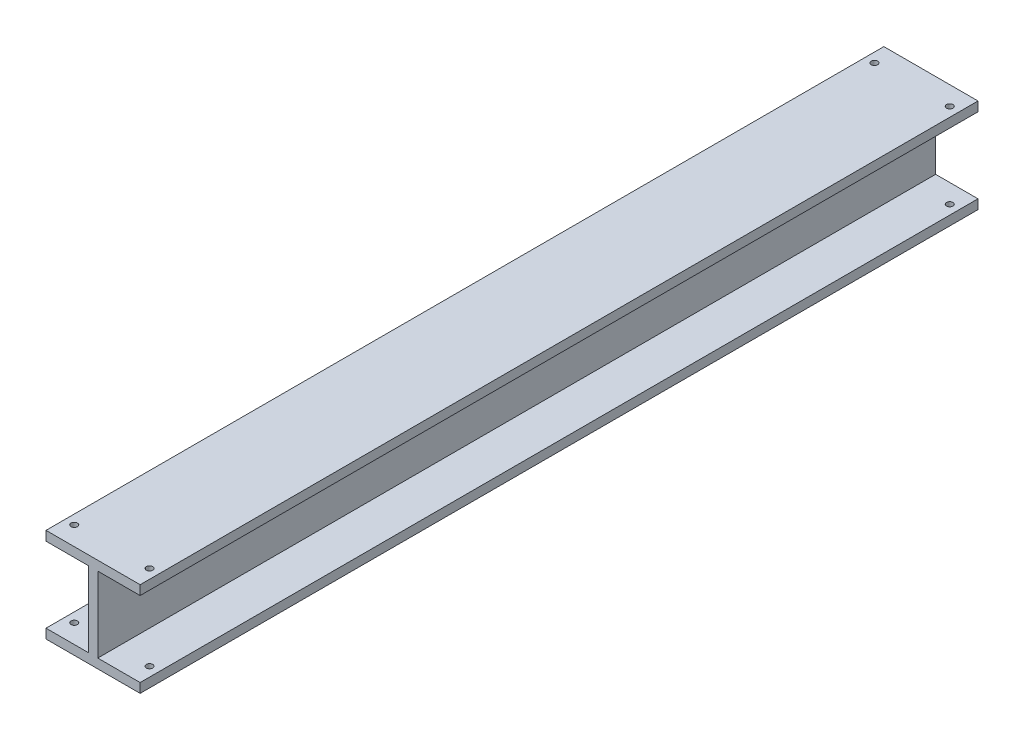
ISO-10303-21;
HEADER;
FILE_DESCRIPTION(('STEP AP214'),'2;1');
FILE_NAME('part.step','',(''),(''),'','','');
FILE_SCHEMA(('AUTOMOTIVE_DESIGN { 1 0 10303 214 1 1 1 1 }'));
ENDSEC;
DATA;
#1=APPLICATION_CONTEXT('core data for automotive mechanical design processes');
#2=APPLICATION_PROTOCOL_DEFINITION('international standard','automotive_design',2000,#1);
#3=PRODUCT_CONTEXT('',#1,'mechanical');
#4=PRODUCT('Part','Part','',(#3));
#5=PRODUCT_RELATED_PRODUCT_CATEGORY('part','',(#4));
#6=PRODUCT_DEFINITION_FORMATION('','',#4);
#7=PRODUCT_DEFINITION_CONTEXT('part definition',#1,'design');
#8=PRODUCT_DEFINITION('design','',#6,#7);
#9=PRODUCT_DEFINITION_SHAPE('','',#8);
#10=(LENGTH_UNIT() NAMED_UNIT(*) SI_UNIT(.MILLI.,.METRE.));
#11=(NAMED_UNIT(*) PLANE_ANGLE_UNIT() SI_UNIT($,.RADIAN.));
#12=(NAMED_UNIT(*) SI_UNIT($,.STERADIAN.) SOLID_ANGLE_UNIT());
#13=UNCERTAINTY_MEASURE_WITH_UNIT(LENGTH_MEASURE(1.E-05),#10,'distance_accuracy_value','');
#14=(GEOMETRIC_REPRESENTATION_CONTEXT(3) GLOBAL_UNCERTAINTY_ASSIGNED_CONTEXT((#13)) GLOBAL_UNIT_ASSIGNED_CONTEXT((#10,
#11,#12)) REPRESENTATION_CONTEXT('',''));
#15=CARTESIAN_POINT('',(0.,0.,0.));
#16=DIRECTION('',(0.,0.,1.));
#17=DIRECTION('',(1.,0.,0.));
#18=AXIS2_PLACEMENT_3D('',#15,#16,#17);
#19=CARTESIAN_POINT('',(-50.,40.,890.));
#20=DIRECTION('',(1.,0.,0.));
#21=DIRECTION('',(0.,0.,-1.));
#22=AXIS2_PLACEMENT_3D('',#19,#20,#21);
#23=PLANE('',#22);
#24=DIRECTION('',(0.,-1.,0.));
#25=VECTOR('',#24,1.);
#26=CARTESIAN_POINT('',(-50.,40.,0.));
#27=LINE('',#26,#25);
#28=CARTESIAN_POINT('',(-50.,50.,0.));
#29=VERTEX_POINT('',#28);
#30=CARTESIAN_POINT('',(-50.,40.,0.));
#31=VERTEX_POINT('',#30);
#32=EDGE_CURVE('E158',#29,#31,#27,.T.);
#33=ORIENTED_EDGE('',*,*,#32,.T.);
#34=DIRECTION('',(0.,0.,-1.));
#35=VECTOR('',#34,1.);
#36=CARTESIAN_POINT('',(-50.,40.,890.));
#37=LINE('',#36,#35);
#38=CARTESIAN_POINT('',(-50.,40.,890.));
#39=VERTEX_POINT('',#38);
#40=EDGE_CURVE('E11',#39,#31,#37,.T.);
#41=ORIENTED_EDGE('',*,*,#40,.F.);
#42=DIRECTION('',(0.,-1.,0.));
#43=VECTOR('',#42,1.);
#44=CARTESIAN_POINT('',(-50.,40.,890.));
#45=LINE('',#44,#43);
#46=CARTESIAN_POINT('',(-50.,50.,890.));
#47=VERTEX_POINT('',#46);
#48=EDGE_CURVE('E181',#47,#39,#45,.T.);
#49=ORIENTED_EDGE('',*,*,#48,.F.);
#50=DIRECTION('',(0.,0.,-1.));
#51=VECTOR('',#50,1.);
#52=CARTESIAN_POINT('',(-50.,50.,890.));
#53=LINE('',#52,#51);
#54=EDGE_CURVE('E154',#47,#29,#53,.T.);
#55=ORIENTED_EDGE('',*,*,#54,.T.);
#56=EDGE_LOOP('',(#33,#41,#49,#55));
#57=FACE_BOUND('',#56,.T.);
#58=ADVANCED_FACE('F38',(#57),#23,.F.);
#59=CARTESIAN_POINT('',(-5.00000000000001,40.,890.));
#60=DIRECTION('',(0.,1.,0.));
#61=DIRECTION('',(-1.,0.,0.));
#62=AXIS2_PLACEMENT_3D('',#59,#60,#61);
#63=PLANE('',#62);
#64=CARTESIAN_POINT('',(-40.,40.,20.));
#65=DIRECTION('',(0.,1.,0.));
#66=DIRECTION('',(-1.,0.,0.));
#67=AXIS2_PLACEMENT_3D('',#64,#65,#66);
#68=CIRCLE('',#67,3.39999999999997);
#69=CARTESIAN_POINT('',(-43.4,40.,20.));
#70=VERTEX_POINT('',#69);
#71=EDGE_CURVE('E334',#70,#70,#68,.F.);
#72=ORIENTED_EDGE('',*,*,#71,.F.);
#73=EDGE_LOOP('',(#72));
#74=FACE_BOUND('',#73,.T.);
#75=CARTESIAN_POINT('',(-40.,40.,870.));
#76=DIRECTION('',(0.,1.,0.));
#77=DIRECTION('',(-1.,0.,0.));
#78=AXIS2_PLACEMENT_3D('',#75,#76,#77);
#79=CIRCLE('',#78,3.39999999999997);
#80=CARTESIAN_POINT('',(-43.4,40.,870.));
#81=VERTEX_POINT('',#80);
#82=EDGE_CURVE('E306',#81,#81,#79,.T.);
#83=ORIENTED_EDGE('',*,*,#82,.T.);
#84=EDGE_LOOP('',(#83));
#85=FACE_BOUND('',#84,.T.);
#86=DIRECTION('',(1.,0.,0.));
#87=VECTOR('',#86,1.);
#88=CARTESIAN_POINT('',(-5.00000000000001,40.,0.));
#89=LINE('',#88,#87);
#90=CARTESIAN_POINT('',(-5.00000000000001,40.,0.));
#91=VERTEX_POINT('',#90);
#92=EDGE_CURVE('E161',#31,#91,#89,.T.);
#93=ORIENTED_EDGE('',*,*,#92,.T.);
#94=DIRECTION('',(0.,0.,-1.));
#95=VECTOR('',#94,1.);
#96=CARTESIAN_POINT('',(-5.00000000000001,40.,890.));
#97=LINE('',#96,#95);
#98=CARTESIAN_POINT('',(-5.00000000000001,40.,890.));
#99=VERTEX_POINT('',#98);
#100=EDGE_CURVE('E46',#99,#91,#97,.T.);
#101=ORIENTED_EDGE('',*,*,#100,.F.);
#102=DIRECTION('',(1.,0.,0.));
#103=VECTOR('',#102,1.);
#104=CARTESIAN_POINT('',(-5.00000000000001,40.,890.));
#105=LINE('',#104,#103);
#106=EDGE_CURVE('E109',#39,#99,#105,.T.);
#107=ORIENTED_EDGE('',*,*,#106,.F.);
#108=ORIENTED_EDGE('',*,*,#40,.T.);
#109=EDGE_LOOP('',(#93,#101,#107,#108));
#110=FACE_BOUND('',#109,.T.);
#111=ADVANCED_FACE('F264',(#74,#85,#110),#63,.F.);
#112=CARTESIAN_POINT('',(-5.00000000000001,-40.,890.));
#113=DIRECTION('',(1.,0.,0.));
#114=DIRECTION('',(0.,0.,-1.));
#115=AXIS2_PLACEMENT_3D('',#112,#113,#114);
#116=PLANE('',#115);
#117=DIRECTION('',(0.,-1.,0.));
#118=VECTOR('',#117,1.);
#119=CARTESIAN_POINT('',(-5.00000000000001,-40.,0.));
#120=LINE('',#119,#118);
#121=CARTESIAN_POINT('',(-5.00000000000001,-40.,0.));
#122=VERTEX_POINT('',#121);
#123=EDGE_CURVE('E164',#91,#122,#120,.T.);
#124=ORIENTED_EDGE('',*,*,#123,.T.);
#125=DIRECTION('',(0.,0.,-1.));
#126=VECTOR('',#125,1.);
#127=CARTESIAN_POINT('',(-5.00000000000001,-40.,890.));
#128=LINE('',#127,#126);
#129=CARTESIAN_POINT('',(-5.00000000000001,-40.,890.));
#130=VERTEX_POINT('',#129);
#131=EDGE_CURVE('E200',#130,#122,#128,.T.);
#132=ORIENTED_EDGE('',*,*,#131,.F.);
#133=DIRECTION('',(0.,-1.,0.));
#134=VECTOR('',#133,1.);
#135=CARTESIAN_POINT('',(-5.00000000000001,-40.,890.));
#136=LINE('',#135,#134);
#137=EDGE_CURVE('E208',#99,#130,#136,.T.);
#138=ORIENTED_EDGE('',*,*,#137,.F.);
#139=ORIENTED_EDGE('',*,*,#100,.T.);
#140=EDGE_LOOP('',(#124,#132,#138,#139));
#141=FACE_BOUND('',#140,.T.);
#142=ADVANCED_FACE('F206',(#141),#116,.F.);
#143=CARTESIAN_POINT('',(-50.,-40.,890.));
#144=DIRECTION('',(0.,-1.,0.));
#145=DIRECTION('',(1.,0.,0.));
#146=AXIS2_PLACEMENT_3D('',#143,#144,#145);
#147=PLANE('',#146);
#148=CARTESIAN_POINT('',(-40.,-40.,20.));
#149=DIRECTION('',(0.,-1.,0.));
#150=DIRECTION('',(1.,0.,0.));
#151=AXIS2_PLACEMENT_3D('',#148,#149,#150);
#152=CIRCLE('',#151,3.39999999999997);
#153=CARTESIAN_POINT('',(-36.6,-40.,20.));
#154=VERTEX_POINT('',#153);
#155=EDGE_CURVE('E337',#154,#154,#152,.F.);
#156=ORIENTED_EDGE('',*,*,#155,.F.);
#157=EDGE_LOOP('',(#156));
#158=FACE_BOUND('',#157,.T.);
#159=CARTESIAN_POINT('',(-40.,-40.,870.));
#160=DIRECTION('',(0.,-1.,0.));
#161=DIRECTION('',(1.,0.,0.));
#162=AXIS2_PLACEMENT_3D('',#159,#160,#161);
#163=CIRCLE('',#162,3.39999999999997);
#164=CARTESIAN_POINT('',(-36.6,-40.,870.));
#165=VERTEX_POINT('',#164);
#166=EDGE_CURVE('E311',#165,#165,#163,.T.);
#167=ORIENTED_EDGE('',*,*,#166,.T.);
#168=EDGE_LOOP('',(#167));
#169=FACE_BOUND('',#168,.T.);
#170=DIRECTION('',(-1.,0.,0.));
#171=VECTOR('',#170,1.);
#172=CARTESIAN_POINT('',(-50.,-40.,0.));
#173=LINE('',#172,#171);
#174=CARTESIAN_POINT('',(-50.,-40.,0.));
#175=VERTEX_POINT('',#174);
#176=EDGE_CURVE('E166',#122,#175,#173,.T.);
#177=ORIENTED_EDGE('',*,*,#176,.T.);
#178=DIRECTION('',(0.,0.,-1.));
#179=VECTOR('',#178,1.);
#180=CARTESIAN_POINT('',(-50.,-40.,890.));
#181=LINE('',#180,#179);
#182=CARTESIAN_POINT('',(-50.,-40.,890.));
#183=VERTEX_POINT('',#182);
#184=EDGE_CURVE('E197',#183,#175,#181,.T.);
#185=ORIENTED_EDGE('',*,*,#184,.F.);
#186=DIRECTION('',(-1.,0.,0.));
#187=VECTOR('',#186,1.);
#188=CARTESIAN_POINT('',(-50.,-40.,890.));
#189=LINE('',#188,#187);
#190=EDGE_CURVE('E226',#130,#183,#189,.T.);
#191=ORIENTED_EDGE('',*,*,#190,.F.);
#192=ORIENTED_EDGE('',*,*,#131,.T.);
#193=EDGE_LOOP('',(#177,#185,#191,#192));
#194=FACE_BOUND('',#193,.T.);
#195=ADVANCED_FACE('F217',(#158,#169,#194),#147,.F.);
#196=CARTESIAN_POINT('',(-50.,-50.,890.));
#197=DIRECTION('',(1.,0.,0.));
#198=DIRECTION('',(0.,0.,-1.));
#199=AXIS2_PLACEMENT_3D('',#196,#197,#198);
#200=PLANE('',#199);
#201=DIRECTION('',(0.,-1.,0.));
#202=VECTOR('',#201,1.);
#203=CARTESIAN_POINT('',(-50.,-50.,0.));
#204=LINE('',#203,#202);
#205=CARTESIAN_POINT('',(-50.,-50.,0.));
#206=VERTEX_POINT('',#205);
#207=EDGE_CURVE('E168',#175,#206,#204,.T.);
#208=ORIENTED_EDGE('',*,*,#207,.T.);
#209=DIRECTION('',(0.,0.,-1.));
#210=VECTOR('',#209,1.);
#211=CARTESIAN_POINT('',(-50.,-50.,890.));
#212=LINE('',#211,#210);
#213=CARTESIAN_POINT('',(-50.,-50.,890.));
#214=VERTEX_POINT('',#213);
#215=EDGE_CURVE('E194',#214,#206,#212,.T.);
#216=ORIENTED_EDGE('',*,*,#215,.F.);
#217=DIRECTION('',(0.,-1.,0.));
#218=VECTOR('',#217,1.);
#219=CARTESIAN_POINT('',(-50.,-50.,890.));
#220=LINE('',#219,#218);
#221=EDGE_CURVE('E223',#183,#214,#220,.T.);
#222=ORIENTED_EDGE('',*,*,#221,.F.);
#223=ORIENTED_EDGE('',*,*,#184,.T.);
#224=EDGE_LOOP('',(#208,#216,#222,#223));
#225=FACE_BOUND('',#224,.T.);
#226=ADVANCED_FACE('F221',(#225),#200,.F.);
#227=CARTESIAN_POINT('',(50.,-50.,890.));
#228=DIRECTION('',(0.,1.,0.));
#229=DIRECTION('',(0.,0.,1.));
#230=AXIS2_PLACEMENT_3D('',#227,#228,#229);
#231=PLANE('',#230);
#232=CARTESIAN_POINT('',(40.,-50.,20.));
#233=DIRECTION('',(0.,-1.,0.));
#234=DIRECTION('',(0.,0.,-1.));
#235=AXIS2_PLACEMENT_3D('',#232,#233,#234);
#236=CIRCLE('',#235,3.39999999999997);
#237=CARTESIAN_POINT('',(40.,-50.,16.6));
#238=VERTEX_POINT('',#237);
#239=EDGE_CURVE('E340',#238,#238,#236,.T.);
#240=ORIENTED_EDGE('',*,*,#239,.F.);
#241=EDGE_LOOP('',(#240));
#242=FACE_BOUND('',#241,.T.);
#243=CARTESIAN_POINT('',(-40.,-50.,20.));
#244=DIRECTION('',(0.,-1.,0.));
#245=DIRECTION('',(0.,0.,1.));
#246=AXIS2_PLACEMENT_3D('',#243,#244,#245);
#247=CIRCLE('',#246,3.39999999999997);
#248=CARTESIAN_POINT('',(-40.,-50.,23.4));
#249=VERTEX_POINT('',#248);
#250=EDGE_CURVE('E344',#249,#249,#247,.T.);
#251=ORIENTED_EDGE('',*,*,#250,.F.);
#252=EDGE_LOOP('',(#251));
#253=FACE_BOUND('',#252,.T.);
#254=CARTESIAN_POINT('',(40.,-50.,870.));
#255=DIRECTION('',(0.,1.,0.));
#256=DIRECTION('',(0.,0.,1.));
#257=AXIS2_PLACEMENT_3D('',#254,#255,#256);
#258=CIRCLE('',#257,3.39999999999997);
#259=CARTESIAN_POINT('',(40.,-50.,873.4));
#260=VERTEX_POINT('',#259);
#261=EDGE_CURVE('E318',#260,#260,#258,.T.);
#262=ORIENTED_EDGE('',*,*,#261,.T.);
#263=EDGE_LOOP('',(#262));
#264=FACE_BOUND('',#263,.T.);
#265=CARTESIAN_POINT('',(-40.,-50.,870.));
#266=DIRECTION('',(0.,1.,0.));
#267=DIRECTION('',(0.,0.,-1.));
#268=AXIS2_PLACEMENT_3D('',#265,#266,#267);
#269=CIRCLE('',#268,3.39999999999997);
#270=CARTESIAN_POINT('',(-40.,-50.,866.6));
#271=VERTEX_POINT('',#270);
#272=EDGE_CURVE('E322',#271,#271,#269,.T.);
#273=ORIENTED_EDGE('',*,*,#272,.T.);
#274=EDGE_LOOP('',(#273));
#275=FACE_BOUND('',#274,.T.);
#276=DIRECTION('',(1.,0.,0.));
#277=VECTOR('',#276,1.);
#278=CARTESIAN_POINT('',(50.,-50.,0.));
#279=LINE('',#278,#277);
#280=CARTESIAN_POINT('',(50.,-50.,0.));
#281=VERTEX_POINT('',#280);
#282=EDGE_CURVE('E170',#206,#281,#279,.T.);
#283=ORIENTED_EDGE('',*,*,#282,.T.);
#284=DIRECTION('',(0.,0.,-1.));
#285=VECTOR('',#284,1.);
#286=CARTESIAN_POINT('',(50.,-50.,890.));
#287=LINE('',#286,#285);
#288=CARTESIAN_POINT('',(50.,-50.,890.));
#289=VERTEX_POINT('',#288);
#290=EDGE_CURVE('E191',#289,#281,#287,.T.);
#291=ORIENTED_EDGE('',*,*,#290,.F.);
#292=DIRECTION('',(1.,0.,0.));
#293=VECTOR('',#292,1.);
#294=CARTESIAN_POINT('',(50.,-50.,890.));
#295=LINE('',#294,#293);
#296=EDGE_CURVE('E225',#214,#289,#295,.T.);
#297=ORIENTED_EDGE('',*,*,#296,.F.);
#298=ORIENTED_EDGE('',*,*,#215,.T.);
#299=EDGE_LOOP('',(#283,#291,#297,#298));
#300=FACE_BOUND('',#299,.T.);
#301=ADVANCED_FACE('F282',(#242,#253,#264,#275,#300),#231,.F.);
#302=CARTESIAN_POINT('',(50.,-40.,890.));
#303=DIRECTION('',(-1.,0.,0.));
#304=DIRECTION('',(0.,0.,1.));
#305=AXIS2_PLACEMENT_3D('',#302,#303,#304);
#306=PLANE('',#305);
#307=DIRECTION('',(0.,1.,0.));
#308=VECTOR('',#307,1.);
#309=CARTESIAN_POINT('',(50.,-40.,0.));
#310=LINE('',#309,#308);
#311=CARTESIAN_POINT('',(50.,-40.,0.));
#312=VERTEX_POINT('',#311);
#313=EDGE_CURVE('E172',#281,#312,#310,.T.);
#314=ORIENTED_EDGE('',*,*,#313,.T.);
#315=DIRECTION('',(0.,0.,-1.));
#316=VECTOR('',#315,1.);
#317=CARTESIAN_POINT('',(50.,-40.,890.));
#318=LINE('',#317,#316);
#319=CARTESIAN_POINT('',(50.,-40.,890.));
#320=VERTEX_POINT('',#319);
#321=EDGE_CURVE('E188',#320,#312,#318,.T.);
#322=ORIENTED_EDGE('',*,*,#321,.F.);
#323=DIRECTION('',(0.,1.,0.));
#324=VECTOR('',#323,1.);
#325=CARTESIAN_POINT('',(50.,-40.,890.));
#326=LINE('',#325,#324);
#327=EDGE_CURVE('E228',#289,#320,#326,.T.);
#328=ORIENTED_EDGE('',*,*,#327,.F.);
#329=ORIENTED_EDGE('',*,*,#290,.T.);
#330=EDGE_LOOP('',(#314,#322,#328,#329));
#331=FACE_BOUND('',#330,.T.);
#332=ADVANCED_FACE('F285',(#331),#306,.F.);
#333=CARTESIAN_POINT('',(5.00000000000001,-40.,890.));
#334=DIRECTION('',(0.,-1.,0.));
#335=DIRECTION('',(1.,0.,0.));
#336=AXIS2_PLACEMENT_3D('',#333,#334,#335);
#337=PLANE('',#336);
#338=CARTESIAN_POINT('',(40.,-40.,20.));
#339=DIRECTION('',(0.,-1.,0.));
#340=DIRECTION('',(1.,0.,0.));
#341=AXIS2_PLACEMENT_3D('',#338,#339,#340);
#342=CIRCLE('',#341,3.39999999999997);
#343=CARTESIAN_POINT('',(43.4,-40.,20.));
#344=VERTEX_POINT('',#343);
#345=EDGE_CURVE('E323',#344,#344,#342,.F.);
#346=ORIENTED_EDGE('',*,*,#345,.F.);
#347=EDGE_LOOP('',(#346));
#348=FACE_BOUND('',#347,.T.);
#349=CARTESIAN_POINT('',(40.,-40.,870.));
#350=DIRECTION('',(0.,-1.,0.));
#351=DIRECTION('',(1.,0.,0.));
#352=AXIS2_PLACEMENT_3D('',#349,#350,#351);
#353=CIRCLE('',#352,3.39999999999997);
#354=CARTESIAN_POINT('',(43.4,-40.,870.));
#355=VERTEX_POINT('',#354);
#356=EDGE_CURVE('E162',#355,#355,#353,.T.);
#357=ORIENTED_EDGE('',*,*,#356,.T.);
#358=EDGE_LOOP('',(#357));
#359=FACE_BOUND('',#358,.T.);
#360=DIRECTION('',(-1.,0.,0.));
#361=VECTOR('',#360,1.);
#362=CARTESIAN_POINT('',(5.00000000000001,-40.,0.));
#363=LINE('',#362,#361);
#364=CARTESIAN_POINT('',(5.00000000000001,-40.,0.));
#365=VERTEX_POINT('',#364);
#366=EDGE_CURVE('E174',#312,#365,#363,.T.);
#367=ORIENTED_EDGE('',*,*,#366,.T.);
#368=DIRECTION('',(0.,0.,-1.));
#369=VECTOR('',#368,1.);
#370=CARTESIAN_POINT('',(5.00000000000001,-40.,890.));
#371=LINE('',#370,#369);
#372=CARTESIAN_POINT('',(5.00000000000001,-40.,890.));
#373=VERTEX_POINT('',#372);
#374=EDGE_CURVE('E185',#373,#365,#371,.T.);
#375=ORIENTED_EDGE('',*,*,#374,.F.);
#376=DIRECTION('',(-1.,0.,0.));
#377=VECTOR('',#376,1.);
#378=CARTESIAN_POINT('',(5.00000000000001,-40.,890.));
#379=LINE('',#378,#377);
#380=EDGE_CURVE('E234',#320,#373,#379,.T.);
#381=ORIENTED_EDGE('',*,*,#380,.F.);
#382=ORIENTED_EDGE('',*,*,#321,.T.);
#383=EDGE_LOOP('',(#367,#375,#381,#382));
#384=FACE_BOUND('',#383,.T.);
#385=ADVANCED_FACE('F240',(#348,#359,#384),#337,.F.);
#386=CARTESIAN_POINT('',(5.00000000000001,40.,890.));
#387=DIRECTION('',(-1.,0.,0.));
#388=DIRECTION('',(0.,0.,1.));
#389=AXIS2_PLACEMENT_3D('',#386,#387,#388);
#390=PLANE('',#389);
#391=DIRECTION('',(0.,1.,0.));
#392=VECTOR('',#391,1.);
#393=CARTESIAN_POINT('',(5.00000000000001,40.,0.));
#394=LINE('',#393,#392);
#395=CARTESIAN_POINT('',(5.00000000000001,40.,0.));
#396=VERTEX_POINT('',#395);
#397=EDGE_CURVE('E176',#365,#396,#394,.T.);
#398=ORIENTED_EDGE('',*,*,#397,.T.);
#399=DIRECTION('',(0.,0.,-1.));
#400=VECTOR('',#399,1.);
#401=CARTESIAN_POINT('',(5.00000000000001,40.,890.));
#402=LINE('',#401,#400);
#403=CARTESIAN_POINT('',(5.00000000000001,40.,890.));
#404=VERTEX_POINT('',#403);
#405=EDGE_CURVE('E149',#404,#396,#402,.T.);
#406=ORIENTED_EDGE('',*,*,#405,.F.);
#407=DIRECTION('',(0.,1.,0.));
#408=VECTOR('',#407,1.);
#409=CARTESIAN_POINT('',(5.00000000000001,40.,890.));
#410=LINE('',#409,#408);
#411=EDGE_CURVE('E140',#373,#404,#410,.T.);
#412=ORIENTED_EDGE('',*,*,#411,.F.);
#413=ORIENTED_EDGE('',*,*,#374,.T.);
#414=EDGE_LOOP('',(#398,#406,#412,#413));
#415=FACE_BOUND('',#414,.T.);
#416=ADVANCED_FACE('F244',(#415),#390,.F.);
#417=CARTESIAN_POINT('',(50.,40.,890.));
#418=DIRECTION('',(0.,1.,0.));
#419=DIRECTION('',(-1.,0.,0.));
#420=AXIS2_PLACEMENT_3D('',#417,#418,#419);
#421=PLANE('',#420);
#422=CARTESIAN_POINT('',(40.,40.,20.));
#423=DIRECTION('',(0.,1.,0.));
#424=DIRECTION('',(-1.,0.,0.));
#425=AXIS2_PLACEMENT_3D('',#422,#423,#424);
#426=CIRCLE('',#425,3.39999999999997);
#427=CARTESIAN_POINT('',(36.6,40.,20.));
#428=VERTEX_POINT('',#427);
#429=EDGE_CURVE('E301',#428,#428,#426,.F.);
#430=ORIENTED_EDGE('',*,*,#429,.F.);
#431=EDGE_LOOP('',(#430));
#432=FACE_BOUND('',#431,.T.);
#433=CARTESIAN_POINT('',(40.,40.,870.));
#434=DIRECTION('',(0.,1.,0.));
#435=DIRECTION('',(-1.,0.,0.));
#436=AXIS2_PLACEMENT_3D('',#433,#434,#435);
#437=CIRCLE('',#436,3.39999999999997);
#438=CARTESIAN_POINT('',(36.6,40.,870.));
#439=VERTEX_POINT('',#438);
#440=EDGE_CURVE('E304',#439,#439,#437,.T.);
#441=ORIENTED_EDGE('',*,*,#440,.T.);
#442=EDGE_LOOP('',(#441));
#443=FACE_BOUND('',#442,.T.);
#444=DIRECTION('',(1.,0.,0.));
#445=VECTOR('',#444,1.);
#446=CARTESIAN_POINT('',(50.,40.,0.));
#447=LINE('',#446,#445);
#448=CARTESIAN_POINT('',(50.,40.,0.));
#449=VERTEX_POINT('',#448);
#450=EDGE_CURVE('E148',#396,#449,#447,.T.);
#451=ORIENTED_EDGE('',*,*,#450,.T.);
#452=DIRECTION('',(0.,0.,-1.));
#453=VECTOR('',#452,1.);
#454=CARTESIAN_POINT('',(50.,40.,890.));
#455=LINE('',#454,#453);
#456=CARTESIAN_POINT('',(50.,40.,890.));
#457=VERTEX_POINT('',#456);
#458=EDGE_CURVE('E145',#457,#449,#455,.T.);
#459=ORIENTED_EDGE('',*,*,#458,.F.);
#460=DIRECTION('',(1.,0.,0.));
#461=VECTOR('',#460,1.);
#462=CARTESIAN_POINT('',(50.,40.,890.));
#463=LINE('',#462,#461);
#464=EDGE_CURVE('E134',#404,#457,#463,.T.);
#465=ORIENTED_EDGE('',*,*,#464,.F.);
#466=ORIENTED_EDGE('',*,*,#405,.T.);
#467=EDGE_LOOP('',(#451,#459,#465,#466));
#468=FACE_BOUND('',#467,.T.);
#469=ADVANCED_FACE('F146',(#432,#443,#468),#421,.F.);
#470=CARTESIAN_POINT('',(50.,50.,890.));
#471=DIRECTION('',(-1.,0.,0.));
#472=DIRECTION('',(0.,0.,1.));
#473=AXIS2_PLACEMENT_3D('',#470,#471,#472);
#474=PLANE('',#473);
#475=DIRECTION('',(0.,1.,0.));
#476=VECTOR('',#475,1.);
#477=CARTESIAN_POINT('',(50.,50.,0.));
#478=LINE('',#477,#476);
#479=CARTESIAN_POINT('',(50.,50.,0.));
#480=VERTEX_POINT('',#479);
#481=EDGE_CURVE('E95',#449,#480,#478,.T.);
#482=ORIENTED_EDGE('',*,*,#481,.T.);
#483=DIRECTION('',(0.,0.,-1.));
#484=VECTOR('',#483,1.);
#485=CARTESIAN_POINT('',(50.,50.,890.));
#486=LINE('',#485,#484);
#487=CARTESIAN_POINT('',(50.,50.,890.));
#488=VERTEX_POINT('',#487);
#489=EDGE_CURVE('E150',#488,#480,#486,.T.);
#490=ORIENTED_EDGE('',*,*,#489,.F.);
#491=DIRECTION('',(0.,1.,0.));
#492=VECTOR('',#491,1.);
#493=CARTESIAN_POINT('',(50.,50.,890.));
#494=LINE('',#493,#492);
#495=EDGE_CURVE('E138',#457,#488,#494,.T.);
#496=ORIENTED_EDGE('',*,*,#495,.F.);
#497=ORIENTED_EDGE('',*,*,#458,.T.);
#498=EDGE_LOOP('',(#482,#490,#496,#497));
#499=FACE_BOUND('',#498,.T.);
#500=ADVANCED_FACE('F152',(#499),#474,.F.);
#501=CARTESIAN_POINT('',(-50.,50.,890.));
#502=DIRECTION('',(0.,-1.,0.));
#503=DIRECTION('',(0.,0.,-1.));
#504=AXIS2_PLACEMENT_3D('',#501,#502,#503);
#505=PLANE('',#504);
#506=CARTESIAN_POINT('',(40.,50.,20.));
#507=DIRECTION('',(0.,-1.,0.));
#508=DIRECTION('',(0.,0.,-1.));
#509=AXIS2_PLACEMENT_3D('',#506,#507,#508);
#510=CIRCLE('',#509,3.39999999999997);
#511=CARTESIAN_POINT('',(40.,50.,16.6));
#512=VERTEX_POINT('',#511);
#513=EDGE_CURVE('E347',#512,#512,#510,.T.);
#514=ORIENTED_EDGE('',*,*,#513,.T.);
#515=EDGE_LOOP('',(#514));
#516=FACE_BOUND('',#515,.T.);
#517=CARTESIAN_POINT('',(-40.,50.,20.));
#518=DIRECTION('',(0.,-1.,0.));
#519=DIRECTION('',(0.,0.,1.));
#520=AXIS2_PLACEMENT_3D('',#517,#518,#519);
#521=CIRCLE('',#520,3.39999999999997);
#522=CARTESIAN_POINT('',(-40.,50.,23.4));
#523=VERTEX_POINT('',#522);
#524=EDGE_CURVE('E341',#523,#523,#521,.T.);
#525=ORIENTED_EDGE('',*,*,#524,.T.);
#526=EDGE_LOOP('',(#525));
#527=FACE_BOUND('',#526,.T.);
#528=CARTESIAN_POINT('',(40.,50.,870.));
#529=DIRECTION('',(0.,1.,0.));
#530=DIRECTION('',(0.,0.,1.));
#531=AXIS2_PLACEMENT_3D('',#528,#529,#530);
#532=CIRCLE('',#531,3.39999999999997);
#533=CARTESIAN_POINT('',(40.,50.,873.4));
#534=VERTEX_POINT('',#533);
#535=EDGE_CURVE('E326',#534,#534,#532,.T.);
#536=ORIENTED_EDGE('',*,*,#535,.F.);
#537=EDGE_LOOP('',(#536));
#538=FACE_BOUND('',#537,.T.);
#539=CARTESIAN_POINT('',(-40.,50.,870.));
#540=DIRECTION('',(0.,1.,0.));
#541=DIRECTION('',(0.,0.,-1.));
#542=AXIS2_PLACEMENT_3D('',#539,#540,#541);
#543=CIRCLE('',#542,3.39999999999997);
#544=CARTESIAN_POINT('',(-40.,50.,866.6));
#545=VERTEX_POINT('',#544);
#546=EDGE_CURVE('E319',#545,#545,#543,.T.);
#547=ORIENTED_EDGE('',*,*,#546,.F.);
#548=EDGE_LOOP('',(#547));
#549=FACE_BOUND('',#548,.T.);
#550=DIRECTION('',(-1.,0.,0.));
#551=VECTOR('',#550,1.);
#552=CARTESIAN_POINT('',(-50.,50.,0.));
#553=LINE('',#552,#551);
#554=EDGE_CURVE('E101',#480,#29,#553,.T.);
#555=ORIENTED_EDGE('',*,*,#554,.T.);
#556=ORIENTED_EDGE('',*,*,#54,.F.);
#557=DIRECTION('',(-1.,0.,0.));
#558=VECTOR('',#557,1.);
#559=CARTESIAN_POINT('',(-50.,50.,890.));
#560=LINE('',#559,#558);
#561=EDGE_CURVE('E54',#488,#47,#560,.T.);
#562=ORIENTED_EDGE('',*,*,#561,.F.);
#563=ORIENTED_EDGE('',*,*,#489,.T.);
#564=EDGE_LOOP('',(#555,#556,#562,#563));
#565=FACE_BOUND('',#564,.T.);
#566=ADVANCED_FACE('F248',(#516,#527,#538,#549,#565),#505,.F.);
#567=CARTESIAN_POINT('',(0.,0.,890.));
#568=DIRECTION('',(0.,0.,-1.));
#569=DIRECTION('',(-1.,0.,0.));
#570=AXIS2_PLACEMENT_3D('',#567,#568,#569);
#571=PLANE('',#570);
#572=ORIENTED_EDGE('',*,*,#48,.T.);
#573=ORIENTED_EDGE('',*,*,#106,.T.);
#574=ORIENTED_EDGE('',*,*,#137,.T.);
#575=ORIENTED_EDGE('',*,*,#190,.T.);
#576=ORIENTED_EDGE('',*,*,#221,.T.);
#577=ORIENTED_EDGE('',*,*,#296,.T.);
#578=ORIENTED_EDGE('',*,*,#327,.T.);
#579=ORIENTED_EDGE('',*,*,#380,.T.);
#580=ORIENTED_EDGE('',*,*,#411,.T.);
#581=ORIENTED_EDGE('',*,*,#464,.T.);
#582=ORIENTED_EDGE('',*,*,#495,.T.);
#583=ORIENTED_EDGE('',*,*,#561,.T.);
#584=EDGE_LOOP('',(#572,#573,#574,#575,#576,#577,#578,#579,#580,#581,#582,#583));
#585=FACE_BOUND('',#584,.T.);
#586=ADVANCED_FACE('F136',(#585),#571,.F.);
#587=CARTESIAN_POINT('',(0.,0.,0.));
#588=DIRECTION('',(0.,0.,-1.));
#589=DIRECTION('',(-1.,0.,0.));
#590=AXIS2_PLACEMENT_3D('',#587,#588,#589);
#591=PLANE('',#590);
#592=ORIENTED_EDGE('',*,*,#32,.F.);
#593=ORIENTED_EDGE('',*,*,#554,.F.);
#594=ORIENTED_EDGE('',*,*,#481,.F.);
#595=ORIENTED_EDGE('',*,*,#450,.F.);
#596=ORIENTED_EDGE('',*,*,#397,.F.);
#597=ORIENTED_EDGE('',*,*,#366,.F.);
#598=ORIENTED_EDGE('',*,*,#313,.F.);
#599=ORIENTED_EDGE('',*,*,#282,.F.);
#600=ORIENTED_EDGE('',*,*,#207,.F.);
#601=ORIENTED_EDGE('',*,*,#176,.F.);
#602=ORIENTED_EDGE('',*,*,#123,.F.);
#603=ORIENTED_EDGE('',*,*,#92,.F.);
#604=EDGE_LOOP('',(#592,#593,#594,#595,#596,#597,#598,#599,#600,#601,#602,#603));
#605=FACE_BOUND('',#604,.T.);
#606=ADVANCED_FACE('F212',(#605),#591,.T.);
#607=CARTESIAN_POINT('',(-40.,-50.,870.));
#608=DIRECTION('',(0.,1.,0.));
#609=DIRECTION('',(0.,0.,1.));
#610=AXIS2_PLACEMENT_3D('',#607,#608,#609);
#611=CYLINDRICAL_SURFACE('',#610,3.39999999999997);
#612=ORIENTED_EDGE('',*,*,#546,.T.);
#613=EDGE_LOOP('',(#612));
#614=FACE_BOUND('',#613,.T.);
#615=ORIENTED_EDGE('',*,*,#82,.F.);
#616=EDGE_LOOP('',(#615));
#617=FACE_BOUND('',#616,.T.);
#618=ADVANCED_FACE('F370',(#614,#617),#611,.F.);
#619=CARTESIAN_POINT('',(40.,-50.,870.));
#620=DIRECTION('',(0.,1.,0.));
#621=DIRECTION('',(0.,0.,1.));
#622=AXIS2_PLACEMENT_3D('',#619,#620,#621);
#623=CYLINDRICAL_SURFACE('',#622,3.39999999999997);
#624=ORIENTED_EDGE('',*,*,#535,.T.);
#625=EDGE_LOOP('',(#624));
#626=FACE_BOUND('',#625,.T.);
#627=ORIENTED_EDGE('',*,*,#440,.F.);
#628=EDGE_LOOP('',(#627));
#629=FACE_BOUND('',#628,.T.);
#630=ADVANCED_FACE('F380',(#626,#629),#623,.F.);
#631=ORIENTED_EDGE('',*,*,#261,.F.);
#632=EDGE_LOOP('',(#631));
#633=FACE_BOUND('',#632,.T.);
#634=ORIENTED_EDGE('',*,*,#356,.F.);
#635=EDGE_LOOP('',(#634));
#636=FACE_BOUND('',#635,.T.);
#637=ADVANCED_FACE('F368',(#633,#636),#623,.F.);
#638=ORIENTED_EDGE('',*,*,#272,.F.);
#639=EDGE_LOOP('',(#638));
#640=FACE_BOUND('',#639,.T.);
#641=ORIENTED_EDGE('',*,*,#166,.F.);
#642=EDGE_LOOP('',(#641));
#643=FACE_BOUND('',#642,.T.);
#644=ADVANCED_FACE('F364',(#640,#643),#611,.F.);
#645=CARTESIAN_POINT('',(-40.,-50.,20.));
#646=DIRECTION('',(0.,1.,0.));
#647=DIRECTION('',(0.,0.,1.));
#648=AXIS2_PLACEMENT_3D('',#645,#646,#647);
#649=CYLINDRICAL_SURFACE('',#648,3.39999999999997);
#650=ORIENTED_EDGE('',*,*,#524,.F.);
#651=EDGE_LOOP('',(#650));
#652=FACE_BOUND('',#651,.T.);
#653=ORIENTED_EDGE('',*,*,#71,.T.);
#654=EDGE_LOOP('',(#653));
#655=FACE_BOUND('',#654,.T.);
#656=ADVANCED_FACE('F367',(#652,#655),#649,.F.);
#657=CARTESIAN_POINT('',(40.,-50.,20.));
#658=DIRECTION('',(0.,1.,0.));
#659=DIRECTION('',(0.,0.,1.));
#660=AXIS2_PLACEMENT_3D('',#657,#658,#659);
#661=CYLINDRICAL_SURFACE('',#660,3.39999999999997);
#662=ORIENTED_EDGE('',*,*,#513,.F.);
#663=EDGE_LOOP('',(#662));
#664=FACE_BOUND('',#663,.T.);
#665=ORIENTED_EDGE('',*,*,#429,.T.);
#666=EDGE_LOOP('',(#665));
#667=FACE_BOUND('',#666,.T.);
#668=ADVANCED_FACE('F376',(#664,#667),#661,.F.);
#669=ORIENTED_EDGE('',*,*,#239,.T.);
#670=EDGE_LOOP('',(#669));
#671=FACE_BOUND('',#670,.T.);
#672=ORIENTED_EDGE('',*,*,#345,.T.);
#673=EDGE_LOOP('',(#672));
#674=FACE_BOUND('',#673,.T.);
#675=ADVANCED_FACE('F352',(#671,#674),#661,.F.);
#676=ORIENTED_EDGE('',*,*,#250,.T.);
#677=EDGE_LOOP('',(#676));
#678=FACE_BOUND('',#677,.T.);
#679=ORIENTED_EDGE('',*,*,#155,.T.);
#680=EDGE_LOOP('',(#679));
#681=FACE_BOUND('',#680,.T.);
#682=ADVANCED_FACE('F379',(#678,#681),#649,.F.);
#683=CLOSED_SHELL('',(#58,#111,#142,#195,#226,#301,#332,#385,#416,#469,#500,#566,#586,#606,#618,
#630,#637,#644,#656,#668,#675,#682));
#684=MANIFOLD_SOLID_BREP('B2',#683);
#685=ADVANCED_BREP_SHAPE_REPRESENTATION('',(#18,#684),#14);
#686=SHAPE_DEFINITION_REPRESENTATION(#9,#685);
ENDSEC;
END-ISO-10303-21;
